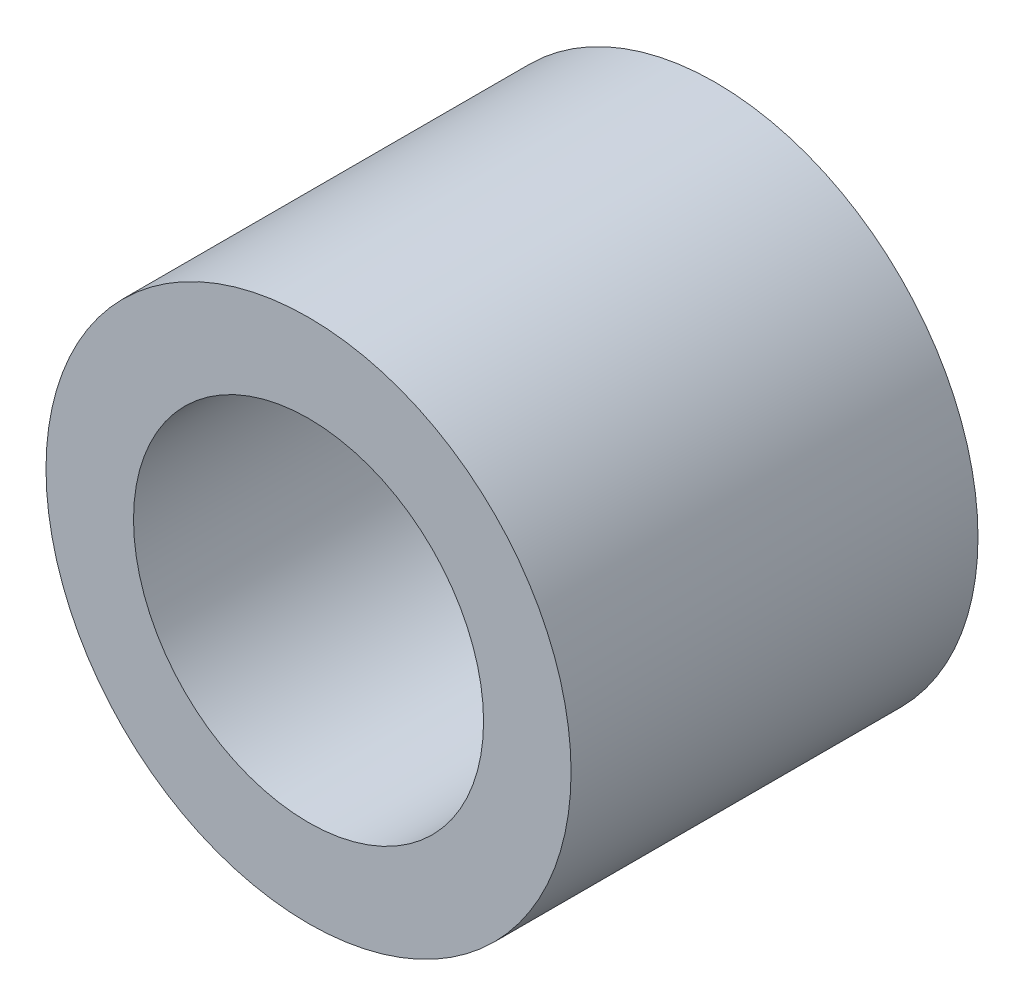
ISO-10303-21;
HEADER;
FILE_DESCRIPTION(('STEP AP214'),'2;1');
FILE_NAME('part.step','',(''),(''),'','','');
FILE_SCHEMA(('AUTOMOTIVE_DESIGN { 1 0 10303 214 1 1 1 1 }'));
ENDSEC;
DATA;
#1=APPLICATION_CONTEXT('core data for automotive mechanical design processes');
#2=APPLICATION_PROTOCOL_DEFINITION('international standard','automotive_design',2000,#1);
#3=PRODUCT_CONTEXT('',#1,'mechanical');
#4=PRODUCT('Part','Part','',(#3));
#5=PRODUCT_RELATED_PRODUCT_CATEGORY('part','',(#4));
#6=PRODUCT_DEFINITION_FORMATION('','',#4);
#7=PRODUCT_DEFINITION_CONTEXT('part definition',#1,'design');
#8=PRODUCT_DEFINITION('design','',#6,#7);
#9=PRODUCT_DEFINITION_SHAPE('','',#8);
#10=(LENGTH_UNIT() NAMED_UNIT(*) SI_UNIT(.MILLI.,.METRE.));
#11=(NAMED_UNIT(*) PLANE_ANGLE_UNIT() SI_UNIT($,.RADIAN.));
#12=(NAMED_UNIT(*) SI_UNIT($,.STERADIAN.) SOLID_ANGLE_UNIT());
#13=UNCERTAINTY_MEASURE_WITH_UNIT(LENGTH_MEASURE(1.E-05),#10,'distance_accuracy_value','');
#14=(GEOMETRIC_REPRESENTATION_CONTEXT(3) GLOBAL_UNCERTAINTY_ASSIGNED_CONTEXT((#13)) GLOBAL_UNIT_ASSIGNED_CONTEXT((#10,
#11,#12)) REPRESENTATION_CONTEXT('',''));
#15=CARTESIAN_POINT('',(0.,0.,0.));
#16=DIRECTION('',(0.,0.,1.));
#17=DIRECTION('',(1.,0.,0.));
#18=AXIS2_PLACEMENT_3D('',#15,#16,#17);
#19=CARTESIAN_POINT('',(0.,0.,13.95));
#20=DIRECTION('',(0.,0.,1.));
#21=DIRECTION('',(1.,0.,0.));
#22=AXIS2_PLACEMENT_3D('',#19,#20,#21);
#23=PLANE('',#22);
#24=CARTESIAN_POINT('',(0.,0.,13.95));
#25=DIRECTION('',(0.,0.,1.));
#26=DIRECTION('',(1.,0.,0.));
#27=AXIS2_PLACEMENT_3D('',#24,#25,#26);
#28=CIRCLE('',#27,9.);
#29=CARTESIAN_POINT('',(9.,0.,13.95));
#30=VERTEX_POINT('',#29);
#31=EDGE_CURVE('E10',#30,#30,#28,.T.);
#32=ORIENTED_EDGE('',*,*,#31,.T.);
#33=EDGE_LOOP('',(#32));
#34=FACE_BOUND('',#33,.T.);
#35=CARTESIAN_POINT('',(0.,0.,13.95));
#36=DIRECTION('',(0.,0.,1.));
#37=DIRECTION('',(1.,0.,0.));
#38=AXIS2_PLACEMENT_3D('',#35,#36,#37);
#39=CIRCLE('',#38,6.);
#40=CARTESIAN_POINT('',(6.,0.,13.95));
#41=VERTEX_POINT('',#40);
#42=EDGE_CURVE('E41',#41,#41,#39,.T.);
#43=ORIENTED_EDGE('',*,*,#42,.F.);
#44=EDGE_LOOP('',(#43));
#45=FACE_BOUND('',#44,.T.);
#46=ADVANCED_FACE('F30',(#34,#45),#23,.T.);
#47=CARTESIAN_POINT('',(0.,0.,0.));
#48=DIRECTION('',(0.,0.,1.));
#49=DIRECTION('',(1.,0.,0.));
#50=AXIS2_PLACEMENT_3D('',#47,#48,#49);
#51=PLANE('',#50);
#52=CARTESIAN_POINT('',(0.,0.,0.));
#53=DIRECTION('',(0.,0.,1.));
#54=DIRECTION('',(1.,0.,0.));
#55=AXIS2_PLACEMENT_3D('',#52,#53,#54);
#56=CIRCLE('',#55,9.);
#57=CARTESIAN_POINT('',(9.,0.,0.));
#58=VERTEX_POINT('',#57);
#59=EDGE_CURVE('E34',#58,#58,#56,.T.);
#60=ORIENTED_EDGE('',*,*,#59,.F.);
#61=EDGE_LOOP('',(#60));
#62=FACE_BOUND('',#61,.T.);
#63=CARTESIAN_POINT('',(0.,0.,0.));
#64=DIRECTION('',(0.,0.,1.));
#65=DIRECTION('',(1.,0.,0.));
#66=AXIS2_PLACEMENT_3D('',#63,#64,#65);
#67=CIRCLE('',#66,6.);
#68=CARTESIAN_POINT('',(6.,0.,0.));
#69=VERTEX_POINT('',#68);
#70=EDGE_CURVE('E43',#69,#69,#67,.T.);
#71=ORIENTED_EDGE('',*,*,#70,.T.);
#72=EDGE_LOOP('',(#71));
#73=FACE_BOUND('',#72,.T.);
#74=ADVANCED_FACE('F53',(#62,#73),#51,.F.);
#75=CARTESIAN_POINT('',(0.,0.,13.95));
#76=DIRECTION('',(0.,0.,-1.));
#77=DIRECTION('',(-1.,0.,0.));
#78=AXIS2_PLACEMENT_3D('',#75,#76,#77);
#79=CYLINDRICAL_SURFACE('',#78,9.);
#80=ORIENTED_EDGE('',*,*,#31,.F.);
#81=EDGE_LOOP('',(#80));
#82=FACE_BOUND('',#81,.T.);
#83=ORIENTED_EDGE('',*,*,#59,.T.);
#84=EDGE_LOOP('',(#83));
#85=FACE_BOUND('',#84,.T.);
#86=ADVANCED_FACE('F32',(#82,#85),#79,.T.);
#87=CARTESIAN_POINT('',(0.,0.,13.95));
#88=DIRECTION('',(0.,0.,-1.));
#89=DIRECTION('',(-1.,0.,0.));
#90=AXIS2_PLACEMENT_3D('',#87,#88,#89);
#91=CYLINDRICAL_SURFACE('',#90,6.);
#92=ORIENTED_EDGE('',*,*,#42,.T.);
#93=EDGE_LOOP('',(#92));
#94=FACE_BOUND('',#93,.T.);
#95=ORIENTED_EDGE('',*,*,#70,.F.);
#96=EDGE_LOOP('',(#95));
#97=FACE_BOUND('',#96,.T.);
#98=ADVANCED_FACE('F49',(#94,#97),#91,.F.);
#99=CLOSED_SHELL('',(#46,#74,#86,#98));
#100=MANIFOLD_SOLID_BREP('B2',#99);
#101=ADVANCED_BREP_SHAPE_REPRESENTATION('',(#18,#100),#14);
#102=SHAPE_DEFINITION_REPRESENTATION(#9,#101);
ENDSEC;
END-ISO-10303-21;
